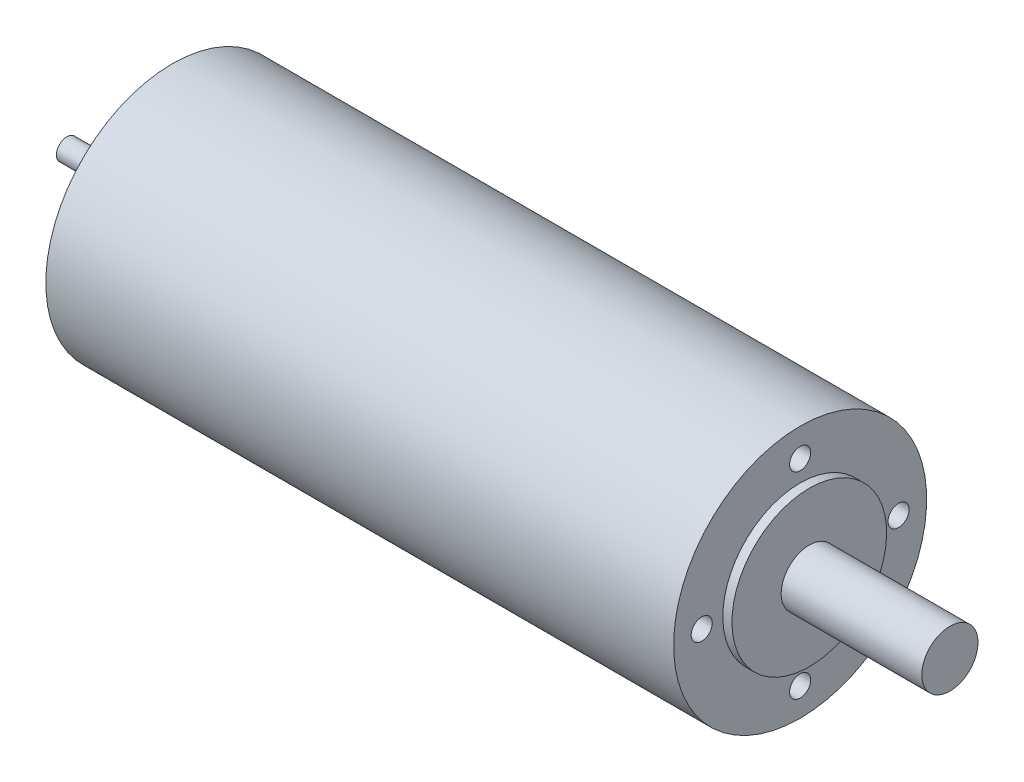
ISO-10303-21;
HEADER;
FILE_DESCRIPTION(('STEP AP214'),'2;1');
FILE_NAME('part.step','',(''),(''),'','','');
FILE_SCHEMA(('AUTOMOTIVE_DESIGN { 1 0 10303 214 1 1 1 1 }'));
ENDSEC;
DATA;
#1=APPLICATION_CONTEXT('core data for automotive mechanical design processes');
#2=APPLICATION_PROTOCOL_DEFINITION('international standard','automotive_design',2000,#1);
#3=PRODUCT_CONTEXT('',#1,'mechanical');
#4=PRODUCT('Part','Part','',(#3));
#5=PRODUCT_RELATED_PRODUCT_CATEGORY('part','',(#4));
#6=PRODUCT_DEFINITION_FORMATION('','',#4);
#7=PRODUCT_DEFINITION_CONTEXT('part definition',#1,'design');
#8=PRODUCT_DEFINITION('design','',#6,#7);
#9=PRODUCT_DEFINITION_SHAPE('','',#8);
#10=(LENGTH_UNIT() NAMED_UNIT(*) SI_UNIT(.MILLI.,.METRE.));
#11=(NAMED_UNIT(*) PLANE_ANGLE_UNIT() SI_UNIT($,.RADIAN.));
#12=(NAMED_UNIT(*) SI_UNIT($,.STERADIAN.) SOLID_ANGLE_UNIT());
#13=UNCERTAINTY_MEASURE_WITH_UNIT(LENGTH_MEASURE(1.E-05),#10,'distance_accuracy_value','');
#14=(GEOMETRIC_REPRESENTATION_CONTEXT(3) GLOBAL_UNCERTAINTY_ASSIGNED_CONTEXT((#13)) GLOBAL_UNIT_ASSIGNED_CONTEXT((#10,
#11,#12)) REPRESENTATION_CONTEXT('',''));
#15=CARTESIAN_POINT('',(0.,0.,0.));
#16=DIRECTION('',(0.,0.,1.));
#17=DIRECTION('',(1.,0.,0.));
#18=AXIS2_PLACEMENT_3D('',#15,#16,#17);
#19=CARTESIAN_POINT('',(-15.,0.,0.));
#20=DIRECTION('',(-1.,0.,0.));
#21=DIRECTION('',(0.,-1.,0.));
#22=AXIS2_PLACEMENT_3D('',#19,#20,#21);
#23=PLANE('',#22);
#24=CARTESIAN_POINT('',(-15.,0.,0.));
#25=DIRECTION('',(1.,0.,0.));
#26=DIRECTION('',(0.,1.,0.));
#27=AXIS2_PLACEMENT_3D('',#24,#25,#26);
#28=CIRCLE('',#27,1.5);
#29=CARTESIAN_POINT('',(-15.,1.5,0.));
#30=VERTEX_POINT('',#29);
#31=EDGE_CURVE('E84',#30,#30,#28,.T.);
#32=ORIENTED_EDGE('',*,*,#31,.F.);
#33=EDGE_LOOP('',(#32));
#34=FACE_BOUND('',#33,.T.);
#35=ADVANCED_FACE('F41',(#34),#23,.T.);
#36=CARTESIAN_POINT('',(110.6,3.8372083288607E-13,0.));
#37=DIRECTION('',(-1.,0.,0.));
#38=DIRECTION('',(0.,-1.,0.));
#39=AXIS2_PLACEMENT_3D('',#36,#37,#38);
#40=PLANE('',#39);
#41=CARTESIAN_POINT('',(110.6,0.,0.));
#42=DIRECTION('',(1.,0.,0.));
#43=DIRECTION('',(0.,1.,0.));
#44=AXIS2_PLACEMENT_3D('',#41,#42,#43);
#45=CIRCLE('',#44,4.);
#46=CARTESIAN_POINT('',(110.6,4.00000000000001,0.));
#47=VERTEX_POINT('',#46);
#48=EDGE_CURVE('E10',#47,#47,#45,.T.);
#49=ORIENTED_EDGE('',*,*,#48,.T.);
#50=EDGE_LOOP('',(#49));
#51=FACE_BOUND('',#50,.T.);
#52=ADVANCED_FACE('F169',(#51),#40,.F.);
#53=CARTESIAN_POINT('',(110.6,0.,0.));
#54=DIRECTION('',(1.,0.,0.));
#55=DIRECTION('',(0.,1.,0.));
#56=AXIS2_PLACEMENT_3D('',#53,#54,#55);
#57=CYLINDRICAL_SURFACE('',#56,4.);
#58=ORIENTED_EDGE('',*,*,#48,.F.);
#59=EDGE_LOOP('',(#58));
#60=FACE_BOUND('',#59,.T.);
#61=CARTESIAN_POINT('',(90.6,0.,0.));
#62=DIRECTION('',(1.,0.,0.));
#63=DIRECTION('',(0.,1.,0.));
#64=AXIS2_PLACEMENT_3D('',#61,#62,#63);
#65=CIRCLE('',#64,4.);
#66=CARTESIAN_POINT('',(90.6,4.00000000000001,0.));
#67=VERTEX_POINT('',#66);
#68=EDGE_CURVE('E48',#67,#67,#65,.T.);
#69=ORIENTED_EDGE('',*,*,#68,.T.);
#70=EDGE_LOOP('',(#69));
#71=FACE_BOUND('',#70,.T.);
#72=ADVANCED_FACE('F174',(#60,#71),#57,.T.);
#73=CARTESIAN_POINT('',(90.6,0.,0.));
#74=DIRECTION('',(-1.,0.,0.));
#75=DIRECTION('',(0.,-1.,0.));
#76=AXIS2_PLACEMENT_3D('',#73,#74,#75);
#77=PLANE('',#76);
#78=ORIENTED_EDGE('',*,*,#68,.F.);
#79=EDGE_LOOP('',(#78));
#80=FACE_BOUND('',#79,.T.);
#81=CARTESIAN_POINT('',(90.6,0.,0.));
#82=DIRECTION('',(1.,0.,0.));
#83=DIRECTION('',(0.,1.,0.));
#84=AXIS2_PLACEMENT_3D('',#81,#82,#83);
#85=CIRCLE('',#84,11.);
#86=CARTESIAN_POINT('',(90.6,11.,0.));
#87=VERTEX_POINT('',#86);
#88=EDGE_CURVE('E53',#87,#87,#85,.T.);
#89=ORIENTED_EDGE('',*,*,#88,.T.);
#90=EDGE_LOOP('',(#89));
#91=FACE_BOUND('',#90,.T.);
#92=ADVANCED_FACE('F288',(#80,#91),#77,.F.);
#93=CARTESIAN_POINT('',(110.6,0.,0.));
#94=DIRECTION('',(1.,0.,0.));
#95=DIRECTION('',(0.,1.,0.));
#96=AXIS2_PLACEMENT_3D('',#93,#94,#95);
#97=CYLINDRICAL_SURFACE('',#96,11.);
#98=ORIENTED_EDGE('',*,*,#88,.F.);
#99=EDGE_LOOP('',(#98));
#100=FACE_BOUND('',#99,.T.);
#101=CARTESIAN_POINT('',(89.3,0.,0.));
#102=DIRECTION('',(1.,0.,0.));
#103=DIRECTION('',(0.,1.,0.));
#104=AXIS2_PLACEMENT_3D('',#101,#102,#103);
#105=CIRCLE('',#104,11.);
#106=CARTESIAN_POINT('',(89.3,11.,0.));
#107=VERTEX_POINT('',#106);
#108=EDGE_CURVE('E58',#107,#107,#105,.T.);
#109=ORIENTED_EDGE('',*,*,#108,.T.);
#110=EDGE_LOOP('',(#109));
#111=FACE_BOUND('',#110,.T.);
#112=ADVANCED_FACE('F134',(#100,#111),#97,.T.);
#113=CARTESIAN_POINT('',(89.3,0.,0.));
#114=DIRECTION('',(-1.,0.,0.));
#115=DIRECTION('',(0.,-1.,0.));
#116=AXIS2_PLACEMENT_3D('',#113,#114,#115);
#117=PLANE('',#116);
#118=CARTESIAN_POINT('',(89.3,14.,0.));
#119=DIRECTION('',(1.,0.,0.));
#120=DIRECTION('',(0.,1.,0.));
#121=AXIS2_PLACEMENT_3D('',#118,#119,#120);
#122=CIRCLE('',#121,1.5);
#123=CARTESIAN_POINT('',(89.3,15.5,0.));
#124=VERTEX_POINT('',#123);
#125=EDGE_CURVE('E113',#124,#124,#122,.T.);
#126=ORIENTED_EDGE('',*,*,#125,.F.);
#127=EDGE_LOOP('',(#126));
#128=FACE_BOUND('',#127,.T.);
#129=CARTESIAN_POINT('',(89.3,0.,-14.));
#130=DIRECTION('',(1.,0.,0.));
#131=DIRECTION('',(0.,1.,0.));
#132=AXIS2_PLACEMENT_3D('',#129,#130,#131);
#133=CIRCLE('',#132,1.5);
#134=CARTESIAN_POINT('',(89.3,1.50000000000001,-14.));
#135=VERTEX_POINT('',#134);
#136=EDGE_CURVE('E109',#135,#135,#133,.T.);
#137=ORIENTED_EDGE('',*,*,#136,.F.);
#138=EDGE_LOOP('',(#137));
#139=FACE_BOUND('',#138,.T.);
#140=CARTESIAN_POINT('',(89.3,-14.,0.));
#141=DIRECTION('',(1.,0.,0.));
#142=DIRECTION('',(0.,1.,0.));
#143=AXIS2_PLACEMENT_3D('',#140,#141,#142);
#144=CIRCLE('',#143,1.5);
#145=CARTESIAN_POINT('',(89.3,-12.5,0.));
#146=VERTEX_POINT('',#145);
#147=EDGE_CURVE('E101',#146,#146,#144,.T.);
#148=ORIENTED_EDGE('',*,*,#147,.F.);
#149=EDGE_LOOP('',(#148));
#150=FACE_BOUND('',#149,.T.);
#151=CARTESIAN_POINT('',(89.3,0.,14.));
#152=DIRECTION('',(1.,0.,0.));
#153=DIRECTION('',(0.,1.,0.));
#154=AXIS2_PLACEMENT_3D('',#151,#152,#153);
#155=CIRCLE('',#154,1.5);
#156=CARTESIAN_POINT('',(89.3,1.5,14.));
#157=VERTEX_POINT('',#156);
#158=EDGE_CURVE('E93',#157,#157,#155,.T.);
#159=ORIENTED_EDGE('',*,*,#158,.F.);
#160=EDGE_LOOP('',(#159));
#161=FACE_BOUND('',#160,.T.);
#162=ORIENTED_EDGE('',*,*,#108,.F.);
#163=EDGE_LOOP('',(#162));
#164=FACE_BOUND('',#163,.T.);
#165=CARTESIAN_POINT('',(89.3,0.,0.));
#166=DIRECTION('',(1.,0.,0.));
#167=DIRECTION('',(0.,1.,0.));
#168=AXIS2_PLACEMENT_3D('',#165,#166,#167);
#169=CIRCLE('',#168,18.);
#170=CARTESIAN_POINT('',(89.3,18.,0.));
#171=VERTEX_POINT('',#170);
#172=EDGE_CURVE('E64',#171,#171,#169,.T.);
#173=ORIENTED_EDGE('',*,*,#172,.T.);
#174=EDGE_LOOP('',(#173));
#175=FACE_BOUND('',#174,.T.);
#176=ADVANCED_FACE('F130',(#128,#139,#150,#161,#164,#175),#117,.F.);
#177=CARTESIAN_POINT('',(110.6,0.,0.));
#178=DIRECTION('',(1.,0.,0.));
#179=DIRECTION('',(0.,1.,0.));
#180=AXIS2_PLACEMENT_3D('',#177,#178,#179);
#181=CYLINDRICAL_SURFACE('',#180,18.);
#182=ORIENTED_EDGE('',*,*,#172,.F.);
#183=EDGE_LOOP('',(#182));
#184=FACE_BOUND('',#183,.T.);
#185=CARTESIAN_POINT('',(0.,0.,0.));
#186=DIRECTION('',(1.,0.,0.));
#187=DIRECTION('',(0.,1.,0.));
#188=AXIS2_PLACEMENT_3D('',#185,#186,#187);
#189=CIRCLE('',#188,18.);
#190=CARTESIAN_POINT('',(0.,18.,0.));
#191=VERTEX_POINT('',#190);
#192=EDGE_CURVE('E68',#191,#191,#189,.T.);
#193=ORIENTED_EDGE('',*,*,#192,.T.);
#194=EDGE_LOOP('',(#193));
#195=FACE_BOUND('',#194,.T.);
#196=ADVANCED_FACE('F133',(#184,#195),#181,.T.);
#197=CARTESIAN_POINT('',(0.,0.,0.));
#198=DIRECTION('',(1.,0.,0.));
#199=DIRECTION('',(0.,1.,0.));
#200=AXIS2_PLACEMENT_3D('',#197,#198,#199);
#201=PLANE('',#200);
#202=ORIENTED_EDGE('',*,*,#192,.F.);
#203=EDGE_LOOP('',(#202));
#204=FACE_BOUND('',#203,.T.);
#205=CARTESIAN_POINT('',(0.,0.,0.));
#206=DIRECTION('',(1.,0.,0.));
#207=DIRECTION('',(0.,1.,0.));
#208=AXIS2_PLACEMENT_3D('',#205,#206,#207);
#209=CIRCLE('',#208,12.);
#210=CARTESIAN_POINT('',(0.,12.,0.));
#211=VERTEX_POINT('',#210);
#212=EDGE_CURVE('E72',#211,#211,#209,.T.);
#213=ORIENTED_EDGE('',*,*,#212,.T.);
#214=EDGE_LOOP('',(#213));
#215=FACE_BOUND('',#214,.T.);
#216=ADVANCED_FACE('F148',(#204,#215),#201,.F.);
#217=CARTESIAN_POINT('',(110.6,0.,0.));
#218=DIRECTION('',(1.,0.,0.));
#219=DIRECTION('',(0.,1.,0.));
#220=AXIS2_PLACEMENT_3D('',#217,#218,#219);
#221=CYLINDRICAL_SURFACE('',#220,12.);
#222=CARTESIAN_POINT('',(-4.,0.,0.));
#223=DIRECTION('',(1.,0.,0.));
#224=DIRECTION('',(0.,1.,0.));
#225=AXIS2_PLACEMENT_3D('',#222,#223,#224);
#226=CIRCLE('',#225,12.);
#227=CARTESIAN_POINT('',(-4.,12.,0.));
#228=VERTEX_POINT('',#227);
#229=EDGE_CURVE('E76',#228,#228,#226,.T.);
#230=ORIENTED_EDGE('',*,*,#229,.T.);
#231=EDGE_LOOP('',(#230));
#232=FACE_BOUND('',#231,.T.);
#233=ORIENTED_EDGE('',*,*,#212,.F.);
#234=EDGE_LOOP('',(#233));
#235=FACE_BOUND('',#234,.T.);
#236=ADVANCED_FACE('F154',(#232,#235),#221,.T.);
#237=CARTESIAN_POINT('',(-4.,0.,0.));
#238=DIRECTION('',(-1.,0.,0.));
#239=DIRECTION('',(0.,-1.,0.));
#240=AXIS2_PLACEMENT_3D('',#237,#238,#239);
#241=PLANE('',#240);
#242=CARTESIAN_POINT('',(-4.,0.,0.));
#243=DIRECTION('',(1.,0.,0.));
#244=DIRECTION('',(0.,1.,0.));
#245=AXIS2_PLACEMENT_3D('',#242,#243,#244);
#246=CIRCLE('',#245,1.5);
#247=CARTESIAN_POINT('',(-4.,1.5,0.));
#248=VERTEX_POINT('',#247);
#249=EDGE_CURVE('E80',#248,#248,#246,.T.);
#250=ORIENTED_EDGE('',*,*,#249,.T.);
#251=EDGE_LOOP('',(#250));
#252=FACE_BOUND('',#251,.T.);
#253=ORIENTED_EDGE('',*,*,#229,.F.);
#254=EDGE_LOOP('',(#253));
#255=FACE_BOUND('',#254,.T.);
#256=ADVANCED_FACE('F159',(#252,#255),#241,.T.);
#257=CARTESIAN_POINT('',(110.6,0.,0.));
#258=DIRECTION('',(1.,0.,0.));
#259=DIRECTION('',(0.,1.,0.));
#260=AXIS2_PLACEMENT_3D('',#257,#258,#259);
#261=CYLINDRICAL_SURFACE('',#260,1.5);
#262=ORIENTED_EDGE('',*,*,#31,.T.);
#263=EDGE_LOOP('',(#262));
#264=FACE_BOUND('',#263,.T.);
#265=ORIENTED_EDGE('',*,*,#249,.F.);
#266=EDGE_LOOP('',(#265));
#267=FACE_BOUND('',#266,.T.);
#268=ADVANCED_FACE('F165',(#264,#267),#261,.T.);
#269=CARTESIAN_POINT('',(79.3,0.,14.));
#270=DIRECTION('',(1.,0.,0.));
#271=DIRECTION('',(0.,1.,0.));
#272=AXIS2_PLACEMENT_3D('',#269,#270,#271);
#273=CYLINDRICAL_SURFACE('',#272,1.5);
#274=CARTESIAN_POINT('',(79.3,0.,14.));
#275=DIRECTION('',(1.,0.,0.));
#276=DIRECTION('',(0.,1.,0.));
#277=AXIS2_PLACEMENT_3D('',#274,#275,#276);
#278=CIRCLE('',#277,1.5);
#279=CARTESIAN_POINT('',(79.3,1.5,14.));
#280=VERTEX_POINT('',#279);
#281=EDGE_CURVE('E89',#280,#280,#278,.T.);
#282=ORIENTED_EDGE('',*,*,#281,.F.);
#283=EDGE_LOOP('',(#282));
#284=FACE_BOUND('',#283,.T.);
#285=ORIENTED_EDGE('',*,*,#158,.T.);
#286=EDGE_LOOP('',(#285));
#287=FACE_BOUND('',#286,.T.);
#288=ADVANCED_FACE('F179',(#284,#287),#273,.F.);
#289=CARTESIAN_POINT('',(79.3,0.,14.));
#290=DIRECTION('',(1.,0.,0.));
#291=DIRECTION('',(0.,1.,0.));
#292=AXIS2_PLACEMENT_3D('',#289,#290,#291);
#293=PLANE('',#292);
#294=ORIENTED_EDGE('',*,*,#281,.T.);
#295=EDGE_LOOP('',(#294));
#296=FACE_BOUND('',#295,.T.);
#297=ADVANCED_FACE('F187',(#296),#293,.T.);
#298=CARTESIAN_POINT('',(79.3,-14.,0.));
#299=DIRECTION('',(1.,0.,0.));
#300=DIRECTION('',(0.,1.,0.));
#301=AXIS2_PLACEMENT_3D('',#298,#299,#300);
#302=CYLINDRICAL_SURFACE('',#301,1.5);
#303=CARTESIAN_POINT('',(79.3,-14.,0.));
#304=DIRECTION('',(1.,0.,0.));
#305=DIRECTION('',(0.,1.,0.));
#306=AXIS2_PLACEMENT_3D('',#303,#304,#305);
#307=CIRCLE('',#306,1.5);
#308=CARTESIAN_POINT('',(79.3,-12.5,0.));
#309=VERTEX_POINT('',#308);
#310=EDGE_CURVE('E97',#309,#309,#307,.T.);
#311=ORIENTED_EDGE('',*,*,#310,.F.);
#312=EDGE_LOOP('',(#311));
#313=FACE_BOUND('',#312,.T.);
#314=ORIENTED_EDGE('',*,*,#147,.T.);
#315=EDGE_LOOP('',(#314));
#316=FACE_BOUND('',#315,.T.);
#317=ADVANCED_FACE('F192',(#313,#316),#302,.F.);
#318=CARTESIAN_POINT('',(79.3,-14.,0.));
#319=DIRECTION('',(1.,0.,0.));
#320=DIRECTION('',(0.,1.,0.));
#321=AXIS2_PLACEMENT_3D('',#318,#319,#320);
#322=PLANE('',#321);
#323=ORIENTED_EDGE('',*,*,#310,.T.);
#324=EDGE_LOOP('',(#323));
#325=FACE_BOUND('',#324,.T.);
#326=ADVANCED_FACE('F195',(#325),#322,.T.);
#327=CARTESIAN_POINT('',(79.3,0.,-14.));
#328=DIRECTION('',(1.,0.,0.));
#329=DIRECTION('',(0.,1.,0.));
#330=AXIS2_PLACEMENT_3D('',#327,#328,#329);
#331=CYLINDRICAL_SURFACE('',#330,1.5);
#332=CARTESIAN_POINT('',(79.3,0.,-14.));
#333=DIRECTION('',(1.,0.,0.));
#334=DIRECTION('',(0.,1.,0.));
#335=AXIS2_PLACEMENT_3D('',#332,#333,#334);
#336=CIRCLE('',#335,1.5);
#337=CARTESIAN_POINT('',(79.3,1.50000000000001,-14.));
#338=VERTEX_POINT('',#337);
#339=EDGE_CURVE('E105',#338,#338,#336,.T.);
#340=ORIENTED_EDGE('',*,*,#339,.F.);
#341=EDGE_LOOP('',(#340));
#342=FACE_BOUND('',#341,.T.);
#343=ORIENTED_EDGE('',*,*,#136,.T.);
#344=EDGE_LOOP('',(#343));
#345=FACE_BOUND('',#344,.T.);
#346=ADVANCED_FACE('F198',(#342,#345),#331,.F.);
#347=CARTESIAN_POINT('',(79.3,0.,-14.));
#348=DIRECTION('',(1.,0.,0.));
#349=DIRECTION('',(0.,1.,0.));
#350=AXIS2_PLACEMENT_3D('',#347,#348,#349);
#351=PLANE('',#350);
#352=ORIENTED_EDGE('',*,*,#339,.T.);
#353=EDGE_LOOP('',(#352));
#354=FACE_BOUND('',#353,.T.);
#355=ADVANCED_FACE('F126',(#354),#351,.T.);
#356=CARTESIAN_POINT('',(79.3,14.,0.));
#357=DIRECTION('',(1.,0.,0.));
#358=DIRECTION('',(0.,1.,0.));
#359=AXIS2_PLACEMENT_3D('',#356,#357,#358);
#360=CYLINDRICAL_SURFACE('',#359,1.5);
#361=CARTESIAN_POINT('',(79.3,14.,0.));
#362=DIRECTION('',(1.,0.,0.));
#363=DIRECTION('',(0.,1.,0.));
#364=AXIS2_PLACEMENT_3D('',#361,#362,#363);
#365=CIRCLE('',#364,1.5);
#366=CARTESIAN_POINT('',(79.3,15.5,0.));
#367=VERTEX_POINT('',#366);
#368=EDGE_CURVE('E88',#367,#367,#365,.T.);
#369=ORIENTED_EDGE('',*,*,#368,.F.);
#370=EDGE_LOOP('',(#369));
#371=FACE_BOUND('',#370,.T.);
#372=ORIENTED_EDGE('',*,*,#125,.T.);
#373=EDGE_LOOP('',(#372));
#374=FACE_BOUND('',#373,.T.);
#375=ADVANCED_FACE('F123',(#371,#374),#360,.F.);
#376=CARTESIAN_POINT('',(79.3,14.,0.));
#377=DIRECTION('',(1.,0.,0.));
#378=DIRECTION('',(0.,1.,0.));
#379=AXIS2_PLACEMENT_3D('',#376,#377,#378);
#380=PLANE('',#379);
#381=ORIENTED_EDGE('',*,*,#368,.T.);
#382=EDGE_LOOP('',(#381));
#383=FACE_BOUND('',#382,.T.);
#384=ADVANCED_FACE('F121',(#383),#380,.T.);
#385=CLOSED_SHELL('',(#35,#52,#72,#92,#112,#176,#196,#216,#236,#256,#268,#288,#297,#317,#326,
#346,#355,#375,#384));
#386=MANIFOLD_SOLID_BREP('B2',#385);
#387=ADVANCED_BREP_SHAPE_REPRESENTATION('',(#18,#386),#14);
#388=SHAPE_DEFINITION_REPRESENTATION(#9,#387);
ENDSEC;
END-ISO-10303-21;
